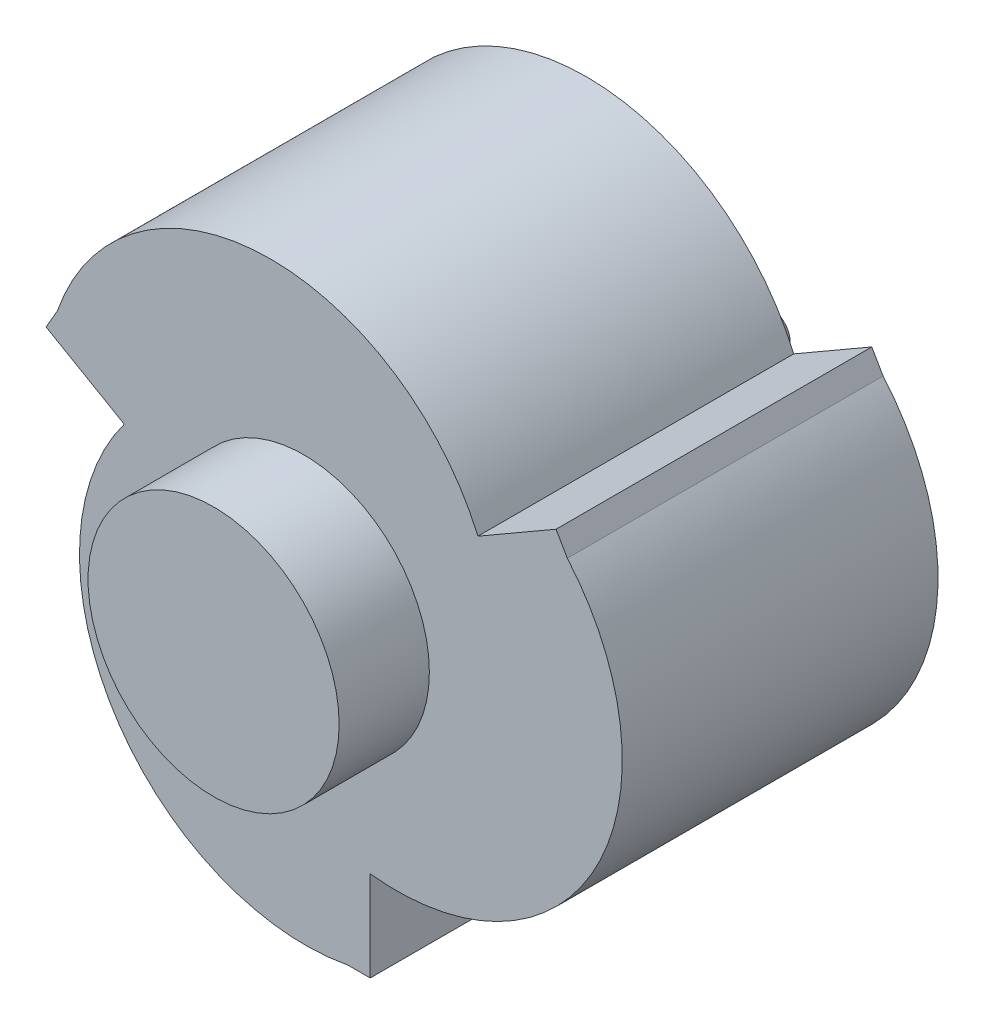
ISO-10303-21;
HEADER;
FILE_DESCRIPTION(('STEP AP214'),'2;1');
FILE_NAME('part.step','',(''),(''),'','','');
FILE_SCHEMA(('AUTOMOTIVE_DESIGN { 1 0 10303 214 1 1 1 1 }'));
ENDSEC;
DATA;
#1=APPLICATION_CONTEXT('core data for automotive mechanical design processes');
#2=APPLICATION_PROTOCOL_DEFINITION('international standard','automotive_design',2000,#1);
#3=PRODUCT_CONTEXT('',#1,'mechanical');
#4=PRODUCT('Part','Part','',(#3));
#5=PRODUCT_RELATED_PRODUCT_CATEGORY('part','',(#4));
#6=PRODUCT_DEFINITION_FORMATION('','',#4);
#7=PRODUCT_DEFINITION_CONTEXT('part definition',#1,'design');
#8=PRODUCT_DEFINITION('design','',#6,#7);
#9=PRODUCT_DEFINITION_SHAPE('','',#8);
#10=(LENGTH_UNIT() NAMED_UNIT(*) SI_UNIT(.MILLI.,.METRE.));
#11=(NAMED_UNIT(*) PLANE_ANGLE_UNIT() SI_UNIT($,.RADIAN.));
#12=(NAMED_UNIT(*) SI_UNIT($,.STERADIAN.) SOLID_ANGLE_UNIT());
#13=UNCERTAINTY_MEASURE_WITH_UNIT(LENGTH_MEASURE(1.E-05),#10,'distance_accuracy_value','');
#14=(GEOMETRIC_REPRESENTATION_CONTEXT(3) GLOBAL_UNCERTAINTY_ASSIGNED_CONTEXT((#13)) GLOBAL_UNIT_ASSIGNED_CONTEXT((#10,
#11,#12)) REPRESENTATION_CONTEXT('',''));
#15=CARTESIAN_POINT('',(0.,0.,0.));
#16=DIRECTION('',(0.,0.,1.));
#17=DIRECTION('',(1.,0.,0.));
#18=AXIS2_PLACEMENT_3D('',#15,#16,#17);
#19=CARTESIAN_POINT('',(-65.4433979738066,23.6310790593777,18.));
#20=DIRECTION('',(0.,0.,-1.));
#21=DIRECTION('',(-1.,0.,0.));
#22=AXIS2_PLACEMENT_3D('',#19,#20,#21);
#23=CYLINDRICAL_SURFACE('',#22,13.6173205943992);
#24=CARTESIAN_POINT('',(-65.4433979738066,23.6310790593777,0.));
#25=DIRECTION('',(0.,0.,1.));
#26=DIRECTION('',(1.,0.,0.));
#27=AXIS2_PLACEMENT_3D('',#24,#25,#26);
#28=CIRCLE('',#27,13.6173205943992);
#29=CARTESIAN_POINT('',(-68.328630305945,10.322929129345,0.));
#30=VERTEX_POINT('',#29);
#31=CARTESIAN_POINT('',(-54.5075496407954,31.7451804518933,0.));
#32=VERTEX_POINT('',#31);
#33=EDGE_CURVE('E189',#30,#32,#28,.T.);
#34=ORIENTED_EDGE('',*,*,#33,.F.);
#35=DIRECTION('',(0.,0.,-1.));
#36=VECTOR('',#35,1.);
#37=CARTESIAN_POINT('',(-68.328630305945,10.322929129345,18.));
#38=LINE('',#37,#36);
#39=CARTESIAN_POINT('',(-68.328630305945,10.322929129345,18.));
#40=VERTEX_POINT('',#39);
#41=EDGE_CURVE('E121',#40,#30,#38,.T.);
#42=ORIENTED_EDGE('',*,*,#41,.F.);
#43=CARTESIAN_POINT('',(-65.4433979738066,23.6310790593777,18.));
#44=DIRECTION('',(0.,0.,1.));
#45=DIRECTION('',(1.,0.,0.));
#46=AXIS2_PLACEMENT_3D('',#43,#44,#45);
#47=CIRCLE('',#46,13.6173205943992);
#48=CARTESIAN_POINT('',(-54.5075496407954,31.7451804518933,18.));
#49=VERTEX_POINT('',#48);
#50=EDGE_CURVE('E55',#40,#49,#47,.T.);
#51=ORIENTED_EDGE('',*,*,#50,.T.);
#52=DIRECTION('',(0.,0.,-1.));
#53=VECTOR('',#52,1.);
#54=CARTESIAN_POINT('',(-54.5075496407954,31.7451804518933,18.));
#55=LINE('',#54,#53);
#56=EDGE_CURVE('E135',#49,#32,#55,.T.);
#57=ORIENTED_EDGE('',*,*,#56,.T.);
#58=EDGE_LOOP('',(#34,#42,#51,#57));
#59=FACE_BOUND('',#58,.T.);
#60=ADVANCED_FACE('F33',(#59),#23,.F.);
#61=CARTESIAN_POINT('',(-54.5075496407954,31.7451804518933,18.));
#62=DIRECTION('',(-0.866025403784437,-0.500000000000002,0.));
#63=DIRECTION('',(0.500000000000002,-0.866025403784437,0.));
#64=AXIS2_PLACEMENT_3D('',#61,#62,#63);
#65=PLANE('',#64);
#66=DIRECTION('',(-0.500000000000002,0.866025403784437,0.));
#67=VECTOR('',#66,1.);
#68=CARTESIAN_POINT('',(-54.5075496407954,31.7451804518933,0.));
#69=LINE('',#68,#67);
#70=CARTESIAN_POINT('',(-55.0163435749895,32.6264373965004,0.));
#71=VERTEX_POINT('',#70);
#72=EDGE_CURVE('E239',#32,#71,#69,.T.);
#73=ORIENTED_EDGE('',*,*,#72,.F.);
#74=ORIENTED_EDGE('',*,*,#56,.F.);
#75=DIRECTION('',(-0.500000000000002,0.866025403784437,0.));
#76=VECTOR('',#75,1.);
#77=CARTESIAN_POINT('',(-54.5075496407954,31.7451804518933,18.));
#78=LINE('',#77,#76);
#79=CARTESIAN_POINT('',(-55.0163435749895,32.6264373965004,18.));
#80=VERTEX_POINT('',#79);
#81=EDGE_CURVE('E218',#49,#80,#78,.T.);
#82=ORIENTED_EDGE('',*,*,#81,.T.);
#83=DIRECTION('',(0.,0.,-1.));
#84=VECTOR('',#83,1.);
#85=CARTESIAN_POINT('',(-55.0163435749895,32.6264373965004,18.));
#86=LINE('',#85,#84);
#87=EDGE_CURVE('E133',#80,#71,#86,.T.);
#88=ORIENTED_EDGE('',*,*,#87,.T.);
#89=EDGE_LOOP('',(#73,#74,#82,#88));
#90=FACE_BOUND('',#89,.T.);
#91=ADVANCED_FACE('F339',(#90),#65,.T.);
#92=CARTESIAN_POINT('',(-55.0163435749895,32.6264373965004,18.));
#93=DIRECTION('',(0.5,-0.866025403784439,0.));
#94=DIRECTION('',(0.866025403784439,0.5,0.));
#95=AXIS2_PLACEMENT_3D('',#92,#93,#94);
#96=PLANE('',#95);
#97=DIRECTION('',(-0.866025403784439,-0.5,0.));
#98=VECTOR('',#97,1.);
#99=CARTESIAN_POINT('',(-55.0163435749895,32.6264373965004,0.));
#100=LINE('',#99,#98);
#101=CARTESIAN_POINT('',(-60.2124959976962,29.6264373965004,0.));
#102=VERTEX_POINT('',#101);
#103=EDGE_CURVE('E242',#71,#102,#100,.T.);
#104=ORIENTED_EDGE('',*,*,#103,.F.);
#105=ORIENTED_EDGE('',*,*,#87,.F.);
#106=DIRECTION('',(-0.866025403784439,-0.5,0.));
#107=VECTOR('',#106,1.);
#108=CARTESIAN_POINT('',(-55.0163435749895,32.6264373965004,18.));
#109=LINE('',#108,#107);
#110=CARTESIAN_POINT('',(-60.2124959976961,29.6264373965004,18.));
#111=VERTEX_POINT('',#110);
#112=EDGE_CURVE('E221',#80,#111,#109,.T.);
#113=ORIENTED_EDGE('',*,*,#112,.T.);
#114=DIRECTION('',(0.,0.,-1.));
#115=VECTOR('',#114,1.);
#116=CARTESIAN_POINT('',(-60.2124959976962,29.6264373965004,18.));
#117=LINE('',#116,#115);
#118=EDGE_CURVE('E131',#111,#102,#117,.T.);
#119=ORIENTED_EDGE('',*,*,#118,.T.);
#120=EDGE_LOOP('',(#104,#105,#113,#119));
#121=FACE_BOUND('',#120,.T.);
#122=ADVANCED_FACE('F345',(#121),#96,.T.);
#123=CARTESIAN_POINT('',(-73.1803080805458,25.471046926936,18.));
#124=DIRECTION('',(0.,0.,-1.));
#125=DIRECTION('',(-1.,0.,0.));
#126=AXIS2_PLACEMENT_3D('',#123,#124,#125);
#127=CYLINDRICAL_SURFACE('',#126,13.6173205943992);
#128=CARTESIAN_POINT('',(-73.1803080805458,25.471046926936,0.));
#129=DIRECTION('',(0.,0.,1.));
#130=DIRECTION('',(1.,0.,0.));
#131=AXIS2_PLACEMENT_3D('',#128,#129,#130);
#132=CIRCLE('',#131,13.6173205943992);
#133=CARTESIAN_POINT('',(-85.6752501818526,30.8847186989997,0.));
#134=VERTEX_POINT('',#133);
#135=EDGE_CURVE('E245',#102,#134,#132,.T.);
#136=ORIENTED_EDGE('',*,*,#135,.F.);
#137=ORIENTED_EDGE('',*,*,#118,.F.);
#138=CARTESIAN_POINT('',(-73.1803080805458,25.471046926936,18.));
#139=DIRECTION('',(0.,0.,1.));
#140=DIRECTION('',(1.,0.,0.));
#141=AXIS2_PLACEMENT_3D('',#138,#139,#140);
#142=CIRCLE('',#141,13.6173205943992);
#143=CARTESIAN_POINT('',(-85.6752501818526,30.8847186989997,18.));
#144=VERTEX_POINT('',#143);
#145=EDGE_CURVE('E224',#111,#144,#142,.T.);
#146=ORIENTED_EDGE('',*,*,#145,.T.);
#147=DIRECTION('',(0.,0.,-1.));
#148=VECTOR('',#147,1.);
#149=CARTESIAN_POINT('',(-85.6752501818526,30.8847186989997,18.));
#150=LINE('',#149,#148);
#151=EDGE_CURVE('E129',#144,#134,#150,.T.);
#152=ORIENTED_EDGE('',*,*,#151,.T.);
#153=EDGE_LOOP('',(#136,#137,#146,#152));
#154=FACE_BOUND('',#153,.T.);
#155=ADVANCED_FACE('F450',(#154),#127,.F.);
#156=CARTESIAN_POINT('',(-85.6752501818526,30.8847186989997,18.));
#157=DIRECTION('',(0.866025403784437,-0.500000000000002,0.));
#158=DIRECTION('',(0.500000000000002,0.866025403784437,0.));
#159=AXIS2_PLACEMENT_3D('',#156,#157,#158);
#160=PLANE('',#159);
#161=DIRECTION('',(-0.500000000000002,-0.866025403784437,0.));
#162=VECTOR('',#161,1.);
#163=CARTESIAN_POINT('',(-85.6752501818526,30.8847186989997,0.));
#164=LINE('',#163,#162);
#165=CARTESIAN_POINT('',(-86.1840441160467,30.0034617543926,0.));
#166=VERTEX_POINT('',#165);
#167=EDGE_CURVE('E116',#134,#166,#164,.T.);
#168=ORIENTED_EDGE('',*,*,#167,.F.);
#169=ORIENTED_EDGE('',*,*,#151,.F.);
#170=DIRECTION('',(-0.500000000000002,-0.866025403784437,0.));
#171=VECTOR('',#170,1.);
#172=CARTESIAN_POINT('',(-85.6752501818526,30.8847186989997,18.));
#173=LINE('',#172,#171);
#174=CARTESIAN_POINT('',(-86.1840441160467,30.0034617543926,18.));
#175=VERTEX_POINT('',#174);
#176=EDGE_CURVE('E227',#144,#175,#173,.T.);
#177=ORIENTED_EDGE('',*,*,#176,.T.);
#178=DIRECTION('',(0.,0.,-1.));
#179=VECTOR('',#178,1.);
#180=CARTESIAN_POINT('',(-86.1840441160467,30.0034617543926,18.));
#181=LINE('',#180,#179);
#182=EDGE_CURVE('E127',#175,#166,#181,.T.);
#183=ORIENTED_EDGE('',*,*,#182,.T.);
#184=EDGE_LOOP('',(#168,#169,#177,#183));
#185=FACE_BOUND('',#184,.T.);
#186=ADVANCED_FACE('F251',(#185),#160,.T.);
#187=CARTESIAN_POINT('',(-86.1840441160467,30.0034617543926,18.));
#188=DIRECTION('',(0.5,0.866025403784439,0.));
#189=DIRECTION('',(-0.866025403784439,0.5,0.));
#190=AXIS2_PLACEMENT_3D('',#187,#188,#189);
#191=PLANE('',#190);
#192=DIRECTION('',(0.866025403784439,-0.5,0.));
#193=VECTOR('',#192,1.);
#194=CARTESIAN_POINT('',(-86.1840441160467,30.0034617543926,0.));
#195=LINE('',#194,#193);
#196=CARTESIAN_POINT('',(-80.9878916933401,27.0034617543926,0.));
#197=VERTEX_POINT('',#196);
#198=EDGE_CURVE('E114',#166,#197,#195,.T.);
#199=ORIENTED_EDGE('',*,*,#198,.F.);
#200=ORIENTED_EDGE('',*,*,#182,.F.);
#201=DIRECTION('',(0.866025403784439,-0.5,0.));
#202=VECTOR('',#201,1.);
#203=CARTESIAN_POINT('',(-86.1840441160467,30.0034617543926,18.));
#204=LINE('',#203,#202);
#205=CARTESIAN_POINT('',(-80.9878916933401,27.0034617543926,18.));
#206=VERTEX_POINT('',#205);
#207=EDGE_CURVE('E230',#175,#206,#204,.T.);
#208=ORIENTED_EDGE('',*,*,#207,.T.);
#209=DIRECTION('',(0.,0.,-1.));
#210=VECTOR('',#209,1.);
#211=CARTESIAN_POINT('',(-80.9878916933401,27.0034617543926,18.));
#212=LINE('',#211,#210);
#213=EDGE_CURVE('E98',#206,#197,#212,.T.);
#214=ORIENTED_EDGE('',*,*,#213,.T.);
#215=EDGE_LOOP('',(#199,#200,#208,#214));
#216=FACE_BOUND('',#215,.T.);
#217=ADVANCED_FACE('F257',(#216),#191,.T.);
#218=CARTESIAN_POINT('',(-70.9053119426288,17.8507022939242,18.));
#219=DIRECTION('',(0.,0.,-1.));
#220=DIRECTION('',(-1.,0.,0.));
#221=AXIS2_PLACEMENT_3D('',#218,#219,#220);
#222=CYLINDRICAL_SURFACE('',#221,13.6173205943992);
#223=CARTESIAN_POINT('',(-70.9053119426288,17.8507022939242,0.));
#224=DIRECTION('',(0.,0.,1.));
#225=DIRECTION('',(1.,0.,0.));
#226=AXIS2_PLACEMENT_3D('',#223,#224,#225);
#227=CIRCLE('',#226,13.6173205943992);
#228=CARTESIAN_POINT('',(-69.3462181743333,4.32292912934493,0.));
#229=VERTEX_POINT('',#228);
#230=EDGE_CURVE('E91',#197,#229,#227,.T.);
#231=ORIENTED_EDGE('',*,*,#230,.F.);
#232=ORIENTED_EDGE('',*,*,#213,.F.);
#233=CARTESIAN_POINT('',(-70.9053119426288,17.8507022939242,18.));
#234=DIRECTION('',(0.,0.,1.));
#235=DIRECTION('',(1.,0.,0.));
#236=AXIS2_PLACEMENT_3D('',#233,#234,#235);
#237=CIRCLE('',#236,13.6173205943992);
#238=CARTESIAN_POINT('',(-69.3462181743333,4.32292912934493,18.));
#239=VERTEX_POINT('',#238);
#240=EDGE_CURVE('E95',#206,#239,#237,.T.);
#241=ORIENTED_EDGE('',*,*,#240,.T.);
#242=DIRECTION('',(0.,0.,-1.));
#243=VECTOR('',#242,1.);
#244=CARTESIAN_POINT('',(-69.3462181743333,4.32292912934493,18.));
#245=LINE('',#244,#243);
#246=EDGE_CURVE('E86',#239,#229,#245,.T.);
#247=ORIENTED_EDGE('',*,*,#246,.T.);
#248=EDGE_LOOP('',(#231,#232,#241,#247));
#249=FACE_BOUND('',#248,.T.);
#250=ADVANCED_FACE('F88',(#249),#222,.F.);
#251=CARTESIAN_POINT('',(-69.3462181743333,4.32292912934493,18.));
#252=DIRECTION('',(0.,1.,0.));
#253=DIRECTION('',(-1.,0.,0.));
#254=AXIS2_PLACEMENT_3D('',#251,#252,#253);
#255=PLANE('',#254);
#256=DIRECTION('',(1.,0.,0.));
#257=VECTOR('',#256,1.);
#258=CARTESIAN_POINT('',(-69.3462181743333,4.32292912934493,0.));
#259=LINE('',#258,#257);
#260=CARTESIAN_POINT('',(-68.328630305945,4.32292912934494,0.));
#261=VERTEX_POINT('',#260);
#262=EDGE_CURVE('E102',#229,#261,#259,.T.);
#263=ORIENTED_EDGE('',*,*,#262,.F.);
#264=ORIENTED_EDGE('',*,*,#246,.F.);
#265=DIRECTION('',(1.,0.,0.));
#266=VECTOR('',#265,1.);
#267=CARTESIAN_POINT('',(-69.3462181743333,4.32292912934493,18.));
#268=LINE('',#267,#266);
#269=CARTESIAN_POINT('',(-68.328630305945,4.32292912934494,18.));
#270=VERTEX_POINT('',#269);
#271=EDGE_CURVE('E234',#239,#270,#268,.T.);
#272=ORIENTED_EDGE('',*,*,#271,.T.);
#273=DIRECTION('',(0.,0.,-1.));
#274=VECTOR('',#273,1.);
#275=CARTESIAN_POINT('',(-68.328630305945,4.32292912934494,18.));
#276=LINE('',#275,#274);
#277=EDGE_CURVE('E99',#270,#261,#276,.T.);
#278=ORIENTED_EDGE('',*,*,#277,.T.);
#279=EDGE_LOOP('',(#263,#264,#272,#278));
#280=FACE_BOUND('',#279,.T.);
#281=ADVANCED_FACE('F103',(#280),#255,.T.);
#282=CARTESIAN_POINT('',(-68.328630305945,4.32292912934494,18.));
#283=DIRECTION('',(-1.,0.,0.));
#284=DIRECTION('',(0.,-1.,0.));
#285=AXIS2_PLACEMENT_3D('',#282,#283,#284);
#286=PLANE('',#285);
#287=DIRECTION('',(0.,1.,0.));
#288=VECTOR('',#287,1.);
#289=CARTESIAN_POINT('',(-68.328630305945,4.32292912934494,0.));
#290=LINE('',#289,#288);
#291=EDGE_CURVE('E108',#261,#30,#290,.T.);
#292=ORIENTED_EDGE('',*,*,#291,.F.);
#293=ORIENTED_EDGE('',*,*,#277,.F.);
#294=DIRECTION('',(0.,1.,0.));
#295=VECTOR('',#294,1.);
#296=CARTESIAN_POINT('',(-68.328630305945,4.32292912934494,18.));
#297=LINE('',#296,#295);
#298=EDGE_CURVE('E124',#270,#40,#297,.T.);
#299=ORIENTED_EDGE('',*,*,#298,.T.);
#300=ORIENTED_EDGE('',*,*,#41,.T.);
#301=EDGE_LOOP('',(#292,#293,#299,#300));
#302=FACE_BOUND('',#301,.T.);
#303=ADVANCED_FACE('F335',(#302),#286,.T.);
#304=CARTESIAN_POINT('',(-73.4026277469758,25.8236381373927,0.));
#305=DIRECTION('',(0.,0.,1.));
#306=DIRECTION('',(1.,0.,0.));
#307=AXIS2_PLACEMENT_3D('',#304,#305,#306);
#308=PLANE('',#307);
#309=ORIENTED_EDGE('',*,*,#291,.T.);
#310=ORIENTED_EDGE('',*,*,#33,.T.);
#311=ORIENTED_EDGE('',*,*,#72,.T.);
#312=ORIENTED_EDGE('',*,*,#103,.T.);
#313=ORIENTED_EDGE('',*,*,#135,.T.);
#314=ORIENTED_EDGE('',*,*,#167,.T.);
#315=ORIENTED_EDGE('',*,*,#198,.T.);
#316=ORIENTED_EDGE('',*,*,#230,.T.);
#317=ORIENTED_EDGE('',*,*,#262,.T.);
#318=EDGE_LOOP('',(#309,#310,#311,#312,#313,#314,#315,#316,#317));
#319=FACE_BOUND('',#318,.T.);
#320=CARTESIAN_POINT('',(-69.8430059989938,22.317609426746,0.));
#321=DIRECTION('',(0.,0.,-1.));
#322=DIRECTION('',(-1.,0.,0.));
#323=AXIS2_PLACEMENT_3D('',#320,#321,#322);
#324=CIRCLE('',#323,2.7);
#325=CARTESIAN_POINT('',(-72.5430059989938,22.317609426746,0.));
#326=VERTEX_POINT('',#325);
#327=EDGE_CURVE('E199',#326,#326,#324,.T.);
#328=ORIENTED_EDGE('',*,*,#327,.T.);
#329=EDGE_LOOP('',(#328));
#330=FACE_BOUND('',#329,.T.);
#331=ADVANCED_FACE('F110',(#319,#330),#308,.T.);
#332=CARTESIAN_POINT('',(-69.8430059989938,22.317609426746,-1.5));
#333=DIRECTION('',(0.,0.,1.));
#334=DIRECTION('',(1.,0.,0.));
#335=AXIS2_PLACEMENT_3D('',#332,#333,#334);
#336=CYLINDRICAL_SURFACE('',#335,2.7);
#337=CARTESIAN_POINT('',(-69.8430059989938,22.317609426746,-1.5));
#338=DIRECTION('',(0.,0.,-1.));
#339=DIRECTION('',(-1.,0.,0.));
#340=AXIS2_PLACEMENT_3D('',#337,#338,#339);
#341=CIRCLE('',#340,2.7);
#342=CARTESIAN_POINT('',(-72.5430059989938,22.317609426746,-1.5));
#343=VERTEX_POINT('',#342);
#344=EDGE_CURVE('E194',#343,#343,#341,.T.);
#345=ORIENTED_EDGE('',*,*,#344,.T.);
#346=EDGE_LOOP('',(#345));
#347=FACE_BOUND('',#346,.T.);
#348=ORIENTED_EDGE('',*,*,#327,.F.);
#349=EDGE_LOOP('',(#348));
#350=FACE_BOUND('',#349,.T.);
#351=ADVANCED_FACE('F324',(#347,#350),#336,.F.);
#352=CARTESIAN_POINT('',(-65.026885195185,23.6473179330386,18.));
#353=DIRECTION('',(0.,0.,-1.));
#354=DIRECTION('',(-1.,0.,0.));
#355=AXIS2_PLACEMENT_3D('',#352,#353,#354);
#356=PLANE('',#355);
#357=ORIENTED_EDGE('',*,*,#81,.F.);
#358=ORIENTED_EDGE('',*,*,#50,.F.);
#359=ORIENTED_EDGE('',*,*,#298,.F.);
#360=ORIENTED_EDGE('',*,*,#271,.F.);
#361=ORIENTED_EDGE('',*,*,#240,.F.);
#362=ORIENTED_EDGE('',*,*,#207,.F.);
#363=ORIENTED_EDGE('',*,*,#176,.F.);
#364=ORIENTED_EDGE('',*,*,#145,.F.);
#365=ORIENTED_EDGE('',*,*,#112,.F.);
#366=EDGE_LOOP('',(#357,#358,#359,#360,#361,#362,#363,#364,#365));
#367=FACE_BOUND('',#366,.T.);
#368=ADVANCED_FACE('F326',(#367),#356,.T.);
#369=CARTESIAN_POINT('',(-71.1930059989938,22.317609426746,25.5));
#370=DIRECTION('',(0.,0.,1.));
#371=DIRECTION('',(1.,0.,0.));
#372=AXIS2_PLACEMENT_3D('',#369,#370,#371);
#373=CYLINDRICAL_SURFACE('',#372,1.35);
#374=CARTESIAN_POINT('',(-71.1930059989938,22.317609426746,-11.5));
#375=DIRECTION('',(0.,0.,1.));
#376=DIRECTION('',(1.,0.,0.));
#377=AXIS2_PLACEMENT_3D('',#374,#375,#376);
#378=CIRCLE('',#377,1.35);
#379=CARTESIAN_POINT('',(-69.8430059989937,22.317609426746,-11.5));
#380=VERTEX_POINT('',#379);
#381=EDGE_CURVE('E414',#380,#380,#378,.T.);
#382=ORIENTED_EDGE('',*,*,#381,.F.);
#383=EDGE_LOOP('',(#382));
#384=FACE_BOUND('',#383,.T.);
#385=CARTESIAN_POINT('',(-71.1930059989938,22.317609426746,-1.5));
#386=DIRECTION('',(0.,0.,1.));
#387=DIRECTION('',(1.,0.,0.));
#388=AXIS2_PLACEMENT_3D('',#385,#386,#387);
#389=CIRCLE('',#388,1.35);
#390=EDGE_CURVE('E47',#343,#343,#389,.T.);
#391=ORIENTED_EDGE('',*,*,#390,.T.);
#392=EDGE_LOOP('',(#391));
#393=FACE_BOUND('',#392,.T.);
#394=ADVANCED_FACE('F333',(#384,#393),#373,.F.);
#395=CARTESIAN_POINT('',(-71.1930059989938,22.317609426746,-11.5));
#396=DIRECTION('',(0.,0.,1.));
#397=DIRECTION('',(1.,0.,0.));
#398=AXIS2_PLACEMENT_3D('',#395,#396,#397);
#399=CONICAL_SURFACE('',#398,1.35,0.610725964389209);
#400=CARTESIAN_POINT('',(-71.1930059989938,22.317609426746,-1.5));
#401=DIRECTION('',(0.,0.,1.));
#402=DIRECTION('',(1.,0.,0.));
#403=AXIS2_PLACEMENT_3D('',#400,#401,#402);
#404=CIRCLE('',#403,8.35000000000001);
#405=CARTESIAN_POINT('',(-62.8430059989937,22.317609426746,-1.5));
#406=VERTEX_POINT('',#405);
#407=EDGE_CURVE('E409',#406,#406,#404,.T.);
#408=CARTESIAN_POINT('',(-62.8430059989937,22.317609426746,-1.5));
#409=CARTESIAN_POINT('',(-62.9159226656604,22.317609426746,-1.60416666666666));
#410=CARTESIAN_POINT('',(-62.9888393323271,22.317609426746,-1.70833333333333));
#411=CARTESIAN_POINT('',(-63.1346726656604,22.317609426746,-1.91666666666666));
#412=CARTESIAN_POINT('',(-63.2075893323271,22.317609426746,-2.02083333333333));
#413=CARTESIAN_POINT('',(-63.3534226656604,22.317609426746,-2.22916666666667));
#414=CARTESIAN_POINT('',(-63.4263393323271,22.317609426746,-2.33333333333333));
#415=CARTESIAN_POINT('',(-63.5721726656604,22.317609426746,-2.54166666666667));
#416=CARTESIAN_POINT('',(-63.6450893323271,22.317609426746,-2.64583333333333));
#417=CARTESIAN_POINT('',(-63.7909226656604,22.317609426746,-2.85416666666667));
#418=CARTESIAN_POINT('',(-63.8638393323271,22.317609426746,-2.95833333333333));
#419=CARTESIAN_POINT('',(-64.0096726656604,22.317609426746,-3.16666666666667));
#420=CARTESIAN_POINT('',(-64.0825893323271,22.317609426746,-3.27083333333333));
#421=CARTESIAN_POINT('',(-64.2284226656604,22.317609426746,-3.47916666666667));
#422=CARTESIAN_POINT('',(-64.3013393323271,22.317609426746,-3.58333333333333));
#423=CARTESIAN_POINT('',(-64.4471726656604,22.317609426746,-3.79166666666667));
#424=CARTESIAN_POINT('',(-64.5200893323271,22.317609426746,-3.89583333333333));
#425=CARTESIAN_POINT('',(-64.6659226656604,22.317609426746,-4.10416666666667));
#426=CARTESIAN_POINT('',(-64.7388393323271,22.317609426746,-4.20833333333333));
#427=CARTESIAN_POINT('',(-64.8846726656604,22.317609426746,-4.41666666666667));
#428=CARTESIAN_POINT('',(-64.9575893323271,22.317609426746,-4.52083333333333));
#429=CARTESIAN_POINT('',(-65.1034226656604,22.317609426746,-4.72916666666667));
#430=CARTESIAN_POINT('',(-65.1763393323271,22.317609426746,-4.83333333333334));
#431=CARTESIAN_POINT('',(-65.3221726656604,22.317609426746,-5.04166666666667));
#432=CARTESIAN_POINT('',(-65.3950893323271,22.317609426746,-5.14583333333333));
#433=CARTESIAN_POINT('',(-65.5409226656604,22.317609426746,-5.35416666666667));
#434=CARTESIAN_POINT('',(-65.6138393323271,22.317609426746,-5.45833333333333));
#435=CARTESIAN_POINT('',(-65.7596726656604,22.317609426746,-5.66666666666667));
#436=CARTESIAN_POINT('',(-65.8325893323271,22.317609426746,-5.77083333333333));
#437=CARTESIAN_POINT('',(-65.9784226656604,22.317609426746,-5.97916666666667));
#438=CARTESIAN_POINT('',(-66.0513393323271,22.317609426746,-6.08333333333334));
#439=CARTESIAN_POINT('',(-66.1971726656604,22.317609426746,-6.29166666666667));
#440=CARTESIAN_POINT('',(-66.2700893323271,22.317609426746,-6.39583333333333));
#441=CARTESIAN_POINT('',(-66.4159226656604,22.317609426746,-6.60416666666667));
#442=CARTESIAN_POINT('',(-66.4888393323271,22.317609426746,-6.70833333333333));
#443=CARTESIAN_POINT('',(-66.6346726656604,22.317609426746,-6.91666666666667));
#444=CARTESIAN_POINT('',(-66.7075893323271,22.317609426746,-7.02083333333333));
#445=CARTESIAN_POINT('',(-66.8534226656604,22.317609426746,-7.22916666666667));
#446=CARTESIAN_POINT('',(-66.9263393323271,22.317609426746,-7.33333333333334));
#447=CARTESIAN_POINT('',(-67.0721726656604,22.317609426746,-7.54166666666667));
#448=CARTESIAN_POINT('',(-67.1450893323271,22.317609426746,-7.64583333333334));
#449=CARTESIAN_POINT('',(-67.2909226656604,22.317609426746,-7.85416666666667));
#450=CARTESIAN_POINT('',(-67.3638393323271,22.317609426746,-7.95833333333334));
#451=CARTESIAN_POINT('',(-67.5096726656604,22.317609426746,-8.16666666666667));
#452=CARTESIAN_POINT('',(-67.5825893323271,22.317609426746,-8.27083333333334));
#453=CARTESIAN_POINT('',(-67.7284226656604,22.317609426746,-8.47916666666667));
#454=CARTESIAN_POINT('',(-67.8013393323271,22.317609426746,-8.58333333333334));
#455=CARTESIAN_POINT('',(-67.9471726656604,22.317609426746,-8.79166666666667));
#456=CARTESIAN_POINT('',(-68.0200893323271,22.317609426746,-8.89583333333334));
#457=CARTESIAN_POINT('',(-68.1659226656604,22.317609426746,-9.10416666666667));
#458=CARTESIAN_POINT('',(-68.2388393323271,22.317609426746,-9.20833333333334));
#459=CARTESIAN_POINT('',(-68.3846726656604,22.317609426746,-9.41666666666667));
#460=CARTESIAN_POINT('',(-68.4575893323271,22.317609426746,-9.52083333333334));
#461=CARTESIAN_POINT('',(-68.6034226656604,22.317609426746,-9.72916666666667));
#462=CARTESIAN_POINT('',(-68.6763393323271,22.317609426746,-9.83333333333334));
#463=CARTESIAN_POINT('',(-68.8221726656604,22.317609426746,-10.0416666666667));
#464=CARTESIAN_POINT('',(-68.8950893323271,22.317609426746,-10.1458333333333));
#465=CARTESIAN_POINT('',(-69.0409226656604,22.317609426746,-10.3541666666667));
#466=CARTESIAN_POINT('',(-69.1138393323271,22.317609426746,-10.4583333333333));
#467=CARTESIAN_POINT('',(-69.2596726656604,22.317609426746,-10.6666666666667));
#468=CARTESIAN_POINT('',(-69.3325893323271,22.317609426746,-10.7708333333333));
#469=CARTESIAN_POINT('',(-69.4784226656604,22.317609426746,-10.9791666666667));
#470=CARTESIAN_POINT('',(-69.5513393323271,22.317609426746,-11.0833333333333));
#471=CARTESIAN_POINT('',(-69.6971726656604,22.317609426746,-11.2916666666667));
#472=CARTESIAN_POINT('',(-69.7700893323271,22.317609426746,-11.3958333333333));
#473=CARTESIAN_POINT('',(-69.8430059989937,22.317609426746,-11.5));
#474=B_SPLINE_CURVE_WITH_KNOTS('',3,(#408,#409,#410,#411,#412,#413,#414,#415,#416,#417,#418,
#419,#420,#421,#422,#423,#424,#425,#426,#427,#428,#429,#430,#431,#432,#433,#434,#435,#436,#437,
#438,#439,#440,#441,#442,#443,#444,#445,#446,#447,#448,#449,#450,#451,#452,#453,#454,#455,#456,
#457,#458,#459,#460,#461,#462,#463,#464,#465,#466,#467,#468,#469,#470,#471,#472,#473),
.UNSPECIFIED.,.F.,.F.,(4,2,2,2,2,2,2,2,2,2,2,2,2,2,2,2,2,2,2,2,2,2,2,2,2,2,2,2,2,2,2,2,4),(0.,
0.381454862991681,0.762909725983353,1.14436458897503,1.52581945196671,1.90727431495839,
2.28872917795008,2.67018404094175,3.05163890393343,3.43309376692511,3.81454862991679,
4.19600349290846,4.57745835590014,4.95891321889182,5.3403680818835,5.72182294487518,
6.10327780786686,6.48473267085854,6.86618753385022,7.24764239684189,7.62909725983357,
8.01055212282525,8.39200698581693,8.7734618488086,9.15491671180028,9.53637157479197,
9.91782643778365,10.2992813007753,10.680736163767,11.0621910267587,11.4436458897504,
11.825100752742,12.2065556157337),.UNSPECIFIED.);
#475=EDGE_CURVE('BSEAM386',#406,#380,#474,.T.);
#476=ORIENTED_EDGE('',*,*,#407,.F.);
#477=ORIENTED_EDGE('',*,*,#381,.T.);
#478=ORIENTED_EDGE('',*,*,#475,.T.);
#479=ORIENTED_EDGE('',*,*,#475,.F.);
#480=EDGE_LOOP('',(#476,#478,#477,#479));
#481=FACE_BOUND('',#480,.T.);
#482=ADVANCED_FACE('F386',(#481),#399,.T.);
#483=CARTESIAN_POINT('',(-72.5430059989938,22.317609426746,-1.5));
#484=DIRECTION('',(0.,0.,-1.));
#485=DIRECTION('',(-1.,0.,0.));
#486=AXIS2_PLACEMENT_3D('',#483,#484,#485);
#487=PLANE('',#486);
#488=ORIENTED_EDGE('',*,*,#390,.F.);
#489=ORIENTED_EDGE('',*,*,#344,.F.);
#490=EDGE_LOOP('',(#488,#489));
#491=FACE_BOUND('',#490,.T.);
#492=ADVANCED_FACE('F380',(#491),#487,.F.);
#493=CARTESIAN_POINT('',(-65.026885195185,23.6473179330386,19.5));
#494=DIRECTION('',(0.,0.,-1.));
#495=DIRECTION('',(-1.,0.,0.));
#496=AXIS2_PLACEMENT_3D('',#493,#494,#495);
#497=PLANE('',#496);
#498=CARTESIAN_POINT('',(-71.1930059989938,22.317609426746,19.5));
#499=DIRECTION('',(0.,0.,-1.));
#500=DIRECTION('',(-1.,0.,0.));
#501=AXIS2_PLACEMENT_3D('',#498,#499,#500);
#502=CIRCLE('',#501,8.35000000000001);
#503=CARTESIAN_POINT('',(-79.5430059989938,22.317609426746,19.5));
#504=VERTEX_POINT('',#503);
#505=EDGE_CURVE('E11',#504,#504,#502,.F.);
#506=ORIENTED_EDGE('',*,*,#505,.F.);
#507=EDGE_LOOP('',(#506));
#508=FACE_BOUND('',#507,.T.);
#509=CARTESIAN_POINT('',(-65.026885195185,23.6473179330386,19.5));
#510=DIRECTION('',(0.,0.,1.));
#511=DIRECTION('',(-1.,0.,0.));
#512=AXIS2_PLACEMENT_3D('',#509,#510,#511);
#513=CIRCLE('',#512,15.013886832454);
#514=CARTESIAN_POINT('',(-66.7766601992221,8.73574238741011,19.5));
#515=VERTEX_POINT('',#514);
#516=CARTESIAN_POINT('',(-53.6677845892859,33.465038200127,19.5));
#517=VERTEX_POINT('',#516);
#518=EDGE_CURVE('E417',#515,#517,#513,.T.);
#519=ORIENTED_EDGE('',*,*,#518,.T.);
#520=DIRECTION('',(-0.499999999999968,0.866025403784457,0.));
#521=VECTOR('',#520,1.);
#522=CARTESIAN_POINT('',(-54.4177845892858,34.7640763058037,19.5));
#523=LINE('',#522,#521);
#524=CARTESIAN_POINT('',(-54.4177845892858,34.7640763058037,19.5));
#525=VERTEX_POINT('',#524);
#526=EDGE_CURVE('E419',#517,#525,#523,.T.);
#527=ORIENTED_EDGE('',*,*,#526,.T.);
#528=DIRECTION('',(-0.866025403784424,-0.500000000000026,0.));
#529=VECTOR('',#528,1.);
#530=CARTESIAN_POINT('',(-59.6139370119922,31.7640763058036,19.5));
#531=LINE('',#530,#529);
#532=CARTESIAN_POINT('',(-59.6139370119922,31.7640763058036,19.5));
#533=VERTEX_POINT('',#532);
#534=EDGE_CURVE('E308',#525,#533,#531,.T.);
#535=ORIENTED_EDGE('',*,*,#534,.T.);
#536=CARTESIAN_POINT('',(-73.4026277469758,25.8236381373928,19.5));
#537=DIRECTION('',(0.,0.,1.));
#538=DIRECTION('',(-1.,0.,0.));
#539=AXIS2_PLACEMENT_3D('',#536,#537,#538);
#540=CIRCLE('',#539,15.013886832454);
#541=CARTESIAN_POINT('',(-87.5845732084732,30.7520476927004,19.5));
#542=VERTEX_POINT('',#541);
#543=EDGE_CURVE('E304',#533,#542,#540,.T.);
#544=ORIENTED_EDGE('',*,*,#543,.T.);
#545=DIRECTION('',(-0.500000000000029,-0.866025403784422,0.));
#546=VECTOR('',#545,1.);
#547=CARTESIAN_POINT('',(-88.3345732084733,29.4530095870237,19.5));
#548=LINE('',#547,#546);
#549=CARTESIAN_POINT('',(-88.3345732084733,29.4530095870237,19.5));
#550=VERTEX_POINT('',#549);
#551=EDGE_CURVE('E174',#542,#550,#548,.T.);
#552=ORIENTED_EDGE('',*,*,#551,.T.);
#553=DIRECTION('',(0.866025403784453,-0.499999999999975,0.));
#554=VECTOR('',#553,1.);
#555=CARTESIAN_POINT('',(-83.1384207857668,26.453009587024,19.5));
#556=LINE('',#555,#554);
#557=CARTESIAN_POINT('',(-83.1384207857668,26.453009587024,19.5));
#558=VERTEX_POINT('',#557);
#559=EDGE_CURVE('E295',#550,#558,#556,.T.);
#560=ORIENTED_EDGE('',*,*,#559,.T.);
#561=CARTESIAN_POINT('',(-71.0995050548205,17.4818722098066,19.5));
#562=DIRECTION('',(0.,0.,1.));
#563=DIRECTION('',(-1.,0.,0.));
#564=AXIS2_PLACEMENT_3D('',#561,#562,#563);
#565=CIRCLE('',#564,15.013886832454);
#566=CARTESIAN_POINT('',(-68.276660199222,2.73574238741057,19.5));
#567=VERTEX_POINT('',#566);
#568=EDGE_CURVE('E306',#558,#567,#565,.T.);
#569=ORIENTED_EDGE('',*,*,#568,.T.);
#570=DIRECTION('',(1.,0.,0.));
#571=VECTOR('',#570,1.);
#572=CARTESIAN_POINT('',(-66.776660199222,2.73574238741052,19.5));
#573=LINE('',#572,#571);
#574=CARTESIAN_POINT('',(-66.776660199222,2.73574238741052,19.5));
#575=VERTEX_POINT('',#574);
#576=EDGE_CURVE('E313',#567,#575,#573,.T.);
#577=ORIENTED_EDGE('',*,*,#576,.T.);
#578=DIRECTION('',(0.,1.,0.));
#579=VECTOR('',#578,1.);
#580=CARTESIAN_POINT('',(-66.7766601992221,8.73574238741011,19.5));
#581=LINE('',#580,#579);
#582=EDGE_CURVE('E316',#575,#515,#581,.T.);
#583=ORIENTED_EDGE('',*,*,#582,.T.);
#584=EDGE_LOOP('',(#519,#527,#535,#544,#552,#560,#569,#577,#583));
#585=FACE_BOUND('',#584,.T.);
#586=ADVANCED_FACE('F300',(#508,#585),#497,.F.);
#587=CARTESIAN_POINT('',(-87.5845732084734,30.7520476927007,18.));
#588=DIRECTION('',(0.866025403784438,-0.500000000000002,0.));
#589=DIRECTION('',(0.500000000000002,0.866025403784438,0.));
#590=AXIS2_PLACEMENT_3D('',#587,#588,#589);
#591=PLANE('',#590);
#592=DIRECTION('',(0.,0.,-1.));
#593=VECTOR('',#592,1.);
#594=CARTESIAN_POINT('',(-87.5845732084734,30.7520476927007,18.));
#595=LINE('',#594,#593);
#596=CARTESIAN_POINT('',(-87.5845732084734,30.7520476927007,-1.5));
#597=VERTEX_POINT('',#596);
#598=EDGE_CURVE('E41',#542,#597,#595,.T.);
#599=ORIENTED_EDGE('',*,*,#598,.T.);
#600=DIRECTION('',(0.500000000000002,0.866025403784438,0.));
#601=VECTOR('',#600,1.);
#602=CARTESIAN_POINT('',(-87.5845732084734,30.7520476927007,-1.5));
#603=LINE('',#602,#601);
#604=CARTESIAN_POINT('',(-88.3345732084734,29.453009587024,-1.5));
#605=VERTEX_POINT('',#604);
#606=EDGE_CURVE('E171',#605,#597,#603,.T.);
#607=ORIENTED_EDGE('',*,*,#606,.F.);
#608=DIRECTION('',(0.,0.,-1.));
#609=VECTOR('',#608,1.);
#610=CARTESIAN_POINT('',(-88.3345732084734,29.453009587024,18.));
#611=LINE('',#610,#609);
#612=EDGE_CURVE('E159',#550,#605,#611,.T.);
#613=ORIENTED_EDGE('',*,*,#612,.F.);
#614=ORIENTED_EDGE('',*,*,#551,.F.);
#615=EDGE_LOOP('',(#599,#607,#613,#614));
#616=FACE_BOUND('',#615,.T.);
#617=ADVANCED_FACE('F168',(#616),#591,.F.);
#618=CARTESIAN_POINT('',(-88.3345732084734,29.453009587024,18.));
#619=DIRECTION('',(0.5,0.866025403784439,0.));
#620=DIRECTION('',(-0.866025403784439,0.5,0.));
#621=AXIS2_PLACEMENT_3D('',#618,#619,#620);
#622=PLANE('',#621);
#623=ORIENTED_EDGE('',*,*,#612,.T.);
#624=DIRECTION('',(-0.866025403784439,0.5,0.));
#625=VECTOR('',#624,1.);
#626=CARTESIAN_POINT('',(-88.3345732084734,29.453009587024,-1.5));
#627=LINE('',#626,#625);
#628=CARTESIAN_POINT('',(-83.1384207857668,26.453009587024,-1.5));
#629=VERTEX_POINT('',#628);
#630=EDGE_CURVE('E188',#629,#605,#627,.T.);
#631=ORIENTED_EDGE('',*,*,#630,.F.);
#632=DIRECTION('',(0.,0.,-1.));
#633=VECTOR('',#632,1.);
#634=CARTESIAN_POINT('',(-83.1384207857668,26.453009587024,18.));
#635=LINE('',#634,#633);
#636=EDGE_CURVE('E156',#558,#629,#635,.T.);
#637=ORIENTED_EDGE('',*,*,#636,.F.);
#638=ORIENTED_EDGE('',*,*,#559,.F.);
#639=EDGE_LOOP('',(#623,#631,#637,#638));
#640=FACE_BOUND('',#639,.T.);
#641=ADVANCED_FACE('F291',(#640),#622,.F.);
#642=CARTESIAN_POINT('',(-71.0995050548205,17.4818722098066,18.));
#643=DIRECTION('',(0.,0.,-1.));
#644=DIRECTION('',(-1.,0.,0.));
#645=AXIS2_PLACEMENT_3D('',#642,#643,#644);
#646=CYLINDRICAL_SURFACE('',#645,15.013886832454);
#647=ORIENTED_EDGE('',*,*,#636,.T.);
#648=CARTESIAN_POINT('',(-71.0995050548205,17.4818722098066,-1.5));
#649=DIRECTION('',(0.,0.,-1.));
#650=DIRECTION('',(1.,0.,0.));
#651=AXIS2_PLACEMENT_3D('',#648,#649,#650);
#652=CIRCLE('',#651,15.013886832454);
#653=CARTESIAN_POINT('',(-68.276660199222,2.73574238741057,-1.5));
#654=VERTEX_POINT('',#653);
#655=EDGE_CURVE('E214',#654,#629,#652,.T.);
#656=ORIENTED_EDGE('',*,*,#655,.F.);
#657=DIRECTION('',(0.,0.,-1.));
#658=VECTOR('',#657,1.);
#659=CARTESIAN_POINT('',(-68.276660199222,2.73574238741057,18.));
#660=LINE('',#659,#658);
#661=EDGE_CURVE('E153',#567,#654,#660,.T.);
#662=ORIENTED_EDGE('',*,*,#661,.F.);
#663=ORIENTED_EDGE('',*,*,#568,.F.);
#664=EDGE_LOOP('',(#647,#656,#662,#663));
#665=FACE_BOUND('',#664,.T.);
#666=ADVANCED_FACE('F370',(#665),#646,.T.);
#667=CARTESIAN_POINT('',(-68.276660199222,2.73574238741056,18.));
#668=DIRECTION('',(0.,1.,0.));
#669=DIRECTION('',(-1.,0.,0.));
#670=AXIS2_PLACEMENT_3D('',#667,#668,#669);
#671=PLANE('',#670);
#672=ORIENTED_EDGE('',*,*,#661,.T.);
#673=DIRECTION('',(-1.,1.98914958578696E-13,0.));
#674=VECTOR('',#673,1.);
#675=CARTESIAN_POINT('',(-68.276660199222,2.73574238741057,-1.5));
#676=LINE('',#675,#674);
#677=CARTESIAN_POINT('',(-66.7766601992221,2.73574238741027,-1.5));
#678=VERTEX_POINT('',#677);
#679=EDGE_CURVE('E211',#678,#654,#676,.T.);
#680=ORIENTED_EDGE('',*,*,#679,.F.);
#681=DIRECTION('',(0.,0.,-1.));
#682=VECTOR('',#681,1.);
#683=CARTESIAN_POINT('',(-66.776660199222,2.73574238741052,18.));
#684=LINE('',#683,#682);
#685=EDGE_CURVE('E150',#575,#678,#684,.T.);
#686=ORIENTED_EDGE('',*,*,#685,.F.);
#687=ORIENTED_EDGE('',*,*,#576,.F.);
#688=EDGE_LOOP('',(#672,#680,#686,#687));
#689=FACE_BOUND('',#688,.T.);
#690=ADVANCED_FACE('F366',(#689),#671,.F.);
#691=CARTESIAN_POINT('',(-66.776660199222,2.73574238741052,18.));
#692=DIRECTION('',(-1.,0.,0.));
#693=DIRECTION('',(0.,-1.,0.));
#694=AXIS2_PLACEMENT_3D('',#691,#692,#693);
#695=PLANE('',#694);
#696=ORIENTED_EDGE('',*,*,#685,.T.);
#697=DIRECTION('',(0.,-1.,0.));
#698=VECTOR('',#697,1.);
#699=CARTESIAN_POINT('',(-66.7766601992221,2.73574238741027,-1.5));
#700=LINE('',#699,#698);
#701=CARTESIAN_POINT('',(-66.7766601992222,8.73574238741027,-1.5));
#702=VERTEX_POINT('',#701);
#703=EDGE_CURVE('E208',#702,#678,#700,.T.);
#704=ORIENTED_EDGE('',*,*,#703,.F.);
#705=DIRECTION('',(0.,0.,-1.));
#706=VECTOR('',#705,1.);
#707=CARTESIAN_POINT('',(-66.7766601992221,8.73574238741011,18.));
#708=LINE('',#707,#706);
#709=EDGE_CURVE('E147',#515,#702,#708,.T.);
#710=ORIENTED_EDGE('',*,*,#709,.F.);
#711=ORIENTED_EDGE('',*,*,#582,.F.);
#712=EDGE_LOOP('',(#696,#704,#710,#711));
#713=FACE_BOUND('',#712,.T.);
#714=ADVANCED_FACE('F362',(#713),#695,.F.);
#715=CARTESIAN_POINT('',(-65.026885195185,23.6473179330385,18.));
#716=DIRECTION('',(0.,0.,-1.));
#717=DIRECTION('',(-1.,0.,0.));
#718=AXIS2_PLACEMENT_3D('',#715,#716,#717);
#719=CYLINDRICAL_SURFACE('',#718,15.0138868324542);
#720=ORIENTED_EDGE('',*,*,#709,.T.);
#721=CARTESIAN_POINT('',(-65.026885195185,23.6473179330386,-1.5));
#722=DIRECTION('',(0.,0.,-1.));
#723=DIRECTION('',(1.,0.,0.));
#724=AXIS2_PLACEMENT_3D('',#721,#722,#723);
#725=CIRCLE('',#724,15.0138868324542);
#726=CARTESIAN_POINT('',(-53.6677845892859,33.4650382001273,-1.5));
#727=VERTEX_POINT('',#726);
#728=EDGE_CURVE('E205',#727,#702,#725,.T.);
#729=ORIENTED_EDGE('',*,*,#728,.F.);
#730=DIRECTION('',(0.,0.,-1.));
#731=VECTOR('',#730,1.);
#732=CARTESIAN_POINT('',(-53.6677845892857,33.465038200127,18.));
#733=LINE('',#732,#731);
#734=EDGE_CURVE('E144',#517,#727,#733,.T.);
#735=ORIENTED_EDGE('',*,*,#734,.F.);
#736=ORIENTED_EDGE('',*,*,#518,.F.);
#737=EDGE_LOOP('',(#720,#729,#735,#736));
#738=FACE_BOUND('',#737,.T.);
#739=ADVANCED_FACE('F358',(#738),#719,.T.);
#740=CARTESIAN_POINT('',(-53.6677845892855,33.4650382001272,18.));
#741=DIRECTION('',(-0.866025403784439,-0.499999999999998,0.));
#742=DIRECTION('',(0.499999999999999,-0.86602540378444,0.));
#743=AXIS2_PLACEMENT_3D('',#740,#741,#742);
#744=PLANE('',#743);
#745=ORIENTED_EDGE('',*,*,#734,.T.);
#746=DIRECTION('',(0.500000000000079,-0.866025403784393,0.));
#747=VECTOR('',#746,1.);
#748=CARTESIAN_POINT('',(-53.6677845892857,33.4650382001274,-1.5));
#749=LINE('',#748,#747);
#750=CARTESIAN_POINT('',(-54.4177845892857,34.7640763058038,-1.5));
#751=VERTEX_POINT('',#750);
#752=EDGE_CURVE('E196',#751,#727,#749,.T.);
#753=ORIENTED_EDGE('',*,*,#752,.F.);
#754=DIRECTION('',(0.,0.,-1.));
#755=VECTOR('',#754,1.);
#756=CARTESIAN_POINT('',(-54.4177845892855,34.7640763058038,18.));
#757=LINE('',#756,#755);
#758=EDGE_CURVE('E141',#525,#751,#757,.T.);
#759=ORIENTED_EDGE('',*,*,#758,.F.);
#760=ORIENTED_EDGE('',*,*,#526,.F.);
#761=EDGE_LOOP('',(#745,#753,#759,#760));
#762=FACE_BOUND('',#761,.T.);
#763=ADVANCED_FACE('F354',(#762),#744,.F.);
#764=CARTESIAN_POINT('',(-54.4177845892855,34.7640763058038,18.));
#765=DIRECTION('',(0.500000000000029,-0.866025403784422,0.));
#766=DIRECTION('',(0.866025403784422,0.500000000000029,0.));
#767=AXIS2_PLACEMENT_3D('',#764,#765,#766);
#768=PLANE('',#767);
#769=ORIENTED_EDGE('',*,*,#758,.T.);
#770=DIRECTION('',(0.866025403784434,0.500000000000008,0.));
#771=VECTOR('',#770,1.);
#772=CARTESIAN_POINT('',(-54.4177845892857,34.7640763058038,-1.5));
#773=LINE('',#772,#771);
#774=CARTESIAN_POINT('',(-59.6139370119923,31.7640763058038,-1.5));
#775=VERTEX_POINT('',#774);
#776=EDGE_CURVE('E193',#775,#751,#773,.T.);
#777=ORIENTED_EDGE('',*,*,#776,.F.);
#778=DIRECTION('',(0.,0.,-1.));
#779=VECTOR('',#778,1.);
#780=CARTESIAN_POINT('',(-59.6139370119921,31.7640763058036,18.));
#781=LINE('',#780,#779);
#782=EDGE_CURVE('E138',#533,#775,#781,.T.);
#783=ORIENTED_EDGE('',*,*,#782,.F.);
#784=ORIENTED_EDGE('',*,*,#534,.F.);
#785=EDGE_LOOP('',(#769,#777,#783,#784));
#786=FACE_BOUND('',#785,.T.);
#787=ADVANCED_FACE('F351',(#786),#768,.F.);
#788=CARTESIAN_POINT('',(-73.4026277469758,25.8236381373928,18.));
#789=DIRECTION('',(0.,0.,-1.));
#790=DIRECTION('',(-1.,0.,0.));
#791=AXIS2_PLACEMENT_3D('',#788,#789,#790);
#792=CYLINDRICAL_SURFACE('',#791,15.0138868324542);
#793=ORIENTED_EDGE('',*,*,#782,.T.);
#794=CARTESIAN_POINT('',(-73.4026277469758,25.8236381373927,-1.5));
#795=DIRECTION('',(0.,0.,-1.));
#796=DIRECTION('',(1.,0.,0.));
#797=AXIS2_PLACEMENT_3D('',#794,#795,#796);
#798=CIRCLE('',#797,15.0138868324541);
#799=EDGE_CURVE('E185',#597,#775,#798,.T.);
#800=ORIENTED_EDGE('',*,*,#799,.F.);
#801=ORIENTED_EDGE('',*,*,#598,.F.);
#802=ORIENTED_EDGE('',*,*,#543,.F.);
#803=EDGE_LOOP('',(#793,#800,#801,#802));
#804=FACE_BOUND('',#803,.T.);
#805=ADVANCED_FACE('F35',(#804),#792,.T.);
#806=CARTESIAN_POINT('',(-73.4026277469758,25.8236381373927,-1.5));
#807=DIRECTION('',(0.,0.,1.));
#808=DIRECTION('',(1.,0.,0.));
#809=AXIS2_PLACEMENT_3D('',#806,#807,#808);
#810=PLANE('',#809);
#811=ORIENTED_EDGE('',*,*,#407,.T.);
#812=EDGE_LOOP('',(#811));
#813=FACE_BOUND('',#812,.T.);
#814=ORIENTED_EDGE('',*,*,#799,.T.);
#815=ORIENTED_EDGE('',*,*,#776,.T.);
#816=ORIENTED_EDGE('',*,*,#752,.T.);
#817=ORIENTED_EDGE('',*,*,#728,.T.);
#818=ORIENTED_EDGE('',*,*,#703,.T.);
#819=ORIENTED_EDGE('',*,*,#679,.T.);
#820=ORIENTED_EDGE('',*,*,#655,.T.);
#821=ORIENTED_EDGE('',*,*,#630,.T.);
#822=ORIENTED_EDGE('',*,*,#606,.T.);
#823=EDGE_LOOP('',(#814,#815,#816,#817,#818,#819,#820,#821,#822));
#824=FACE_BOUND('',#823,.T.);
#825=ADVANCED_FACE('F182',(#813,#824),#810,.F.);
#826=CARTESIAN_POINT('',(-71.1930059989938,22.317609426746,25.5));
#827=DIRECTION('',(0.,0.,1.));
#828=DIRECTION('',(1.,0.,0.));
#829=AXIS2_PLACEMENT_3D('',#826,#827,#828);
#830=CYLINDRICAL_SURFACE('',#829,8.35000000000001);
#831=CARTESIAN_POINT('',(-71.1930059989938,22.317609426746,25.5));
#832=DIRECTION('',(0.,0.,1.));
#833=DIRECTION('',(1.,0.,0.));
#834=AXIS2_PLACEMENT_3D('',#831,#832,#833);
#835=CIRCLE('',#834,8.35000000000001);
#836=CARTESIAN_POINT('',(-62.8430059989937,22.317609426746,25.5));
#837=VERTEX_POINT('',#836);
#838=EDGE_CURVE('E407',#837,#837,#835,.T.);
#839=ORIENTED_EDGE('',*,*,#838,.F.);
#840=EDGE_LOOP('',(#839));
#841=FACE_BOUND('',#840,.T.);
#842=ORIENTED_EDGE('',*,*,#505,.T.);
#843=EDGE_LOOP('',(#842));
#844=FACE_BOUND('',#843,.T.);
#845=ADVANCED_FACE('F396',(#841,#844),#830,.T.);
#846=CARTESIAN_POINT('',(-79.5430059989938,22.317609426746,25.5));
#847=DIRECTION('',(0.,0.,-1.));
#848=DIRECTION('',(-1.,0.,0.));
#849=AXIS2_PLACEMENT_3D('',#846,#847,#848);
#850=PLANE('',#849);
#851=ORIENTED_EDGE('',*,*,#838,.T.);
#852=EDGE_LOOP('',(#851));
#853=FACE_BOUND('',#852,.T.);
#854=ADVANCED_FACE('F399',(#853),#850,.F.);
#855=CLOSED_SHELL('',(#60,#91,#122,#155,#186,#217,#250,#281,#303,#331,#351,#368,#394,#482,#492,
#586,#617,#641,#666,#690,#714,#739,#763,#787,#805,#825,#845,#854));
#856=MANIFOLD_SOLID_BREP('B2',#855);
#857=ADVANCED_BREP_SHAPE_REPRESENTATION('',(#18,#856),#14);
#858=SHAPE_DEFINITION_REPRESENTATION(#9,#857);
ENDSEC;
END-ISO-10303-21;
